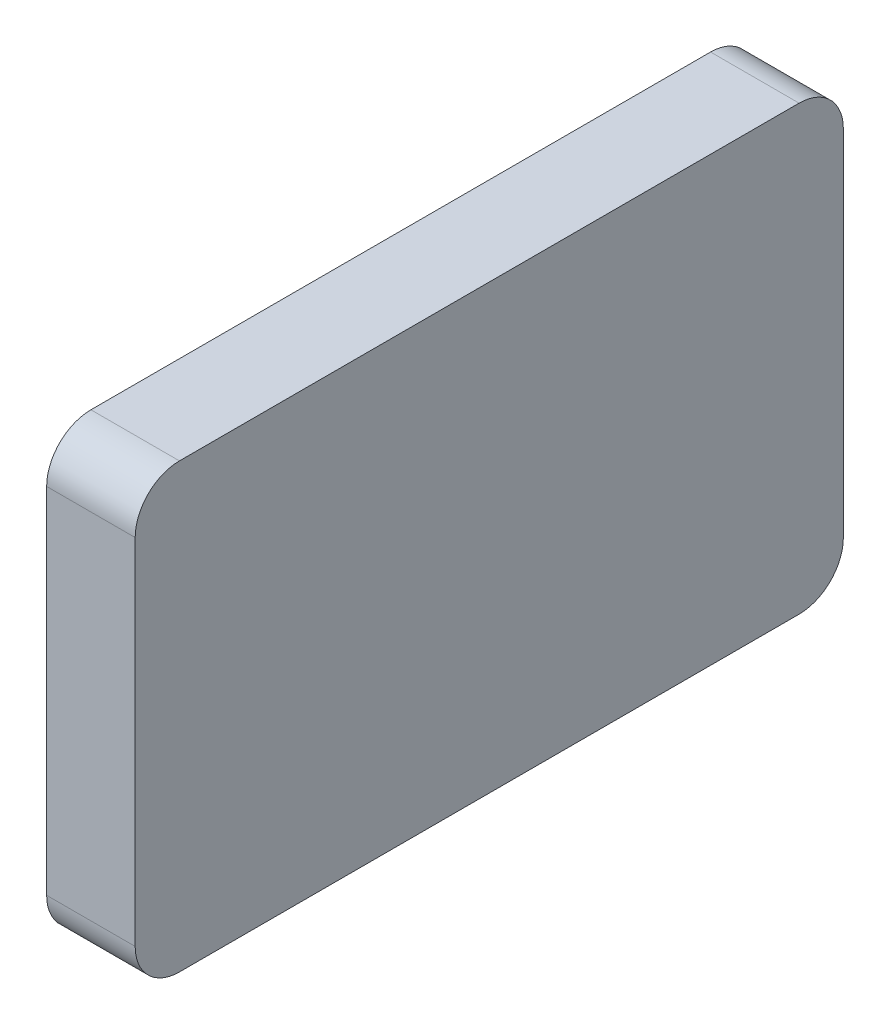
ISO-10303-21;
HEADER;
FILE_DESCRIPTION(('STEP AP214'),'2;1');
FILE_NAME('part.step','',(''),(''),'','','');
FILE_SCHEMA(('AUTOMOTIVE_DESIGN { 1 0 10303 214 1 1 1 1 }'));
ENDSEC;
DATA;
#1=APPLICATION_CONTEXT('core data for automotive mechanical design processes');
#2=APPLICATION_PROTOCOL_DEFINITION('international standard','automotive_design',2000,#1);
#3=PRODUCT_CONTEXT('',#1,'mechanical');
#4=PRODUCT('Part','Part','',(#3));
#5=PRODUCT_RELATED_PRODUCT_CATEGORY('part','',(#4));
#6=PRODUCT_DEFINITION_FORMATION('','',#4);
#7=PRODUCT_DEFINITION_CONTEXT('part definition',#1,'design');
#8=PRODUCT_DEFINITION('design','',#6,#7);
#9=PRODUCT_DEFINITION_SHAPE('','',#8);
#10=(LENGTH_UNIT() NAMED_UNIT(*) SI_UNIT(.MILLI.,.METRE.));
#11=(NAMED_UNIT(*) PLANE_ANGLE_UNIT() SI_UNIT($,.RADIAN.));
#12=(NAMED_UNIT(*) SI_UNIT($,.STERADIAN.) SOLID_ANGLE_UNIT());
#13=UNCERTAINTY_MEASURE_WITH_UNIT(LENGTH_MEASURE(1.E-05),#10,'distance_accuracy_value','');
#14=(GEOMETRIC_REPRESENTATION_CONTEXT(3) GLOBAL_UNCERTAINTY_ASSIGNED_CONTEXT((#13)) GLOBAL_UNIT_ASSIGNED_CONTEXT((#10,
#11,#12)) REPRESENTATION_CONTEXT('',''));
#15=CARTESIAN_POINT('',(0.,0.,0.));
#16=DIRECTION('',(0.,0.,1.));
#17=DIRECTION('',(1.,0.,0.));
#18=AXIS2_PLACEMENT_3D('',#15,#16,#17);
#19=CARTESIAN_POINT('',(0.5,2.5,-4.));
#20=DIRECTION('',(0.,0.,1.));
#21=DIRECTION('',(0.,-1.,0.));
#22=AXIS2_PLACEMENT_3D('',#19,#20,#21);
#23=PLANE('',#22);
#24=DIRECTION('',(0.,1.,0.));
#25=VECTOR('',#24,1.);
#26=CARTESIAN_POINT('',(0.5,2.5,-4.));
#27=LINE('',#26,#25);
#28=CARTESIAN_POINT('',(0.5,-2.,-4.));
#29=VERTEX_POINT('',#28);
#30=CARTESIAN_POINT('',(0.5,2.,-4.));
#31=VERTEX_POINT('',#30);
#32=EDGE_CURVE('E102',#29,#31,#27,.T.);
#33=ORIENTED_EDGE('',*,*,#32,.F.);
#34=DIRECTION('',(-1.,0.,0.));
#35=VECTOR('',#34,1.);
#36=CARTESIAN_POINT('',(0.5,-2.,-4.));
#37=LINE('',#36,#35);
#38=CARTESIAN_POINT('',(-0.5,-2.,-4.));
#39=VERTEX_POINT('',#38);
#40=EDGE_CURVE('E87',#29,#39,#37,.T.);
#41=ORIENTED_EDGE('',*,*,#40,.T.);
#42=DIRECTION('',(0.,1.,0.));
#43=VECTOR('',#42,1.);
#44=CARTESIAN_POINT('',(-0.5,2.5,-4.));
#45=LINE('',#44,#43);
#46=CARTESIAN_POINT('',(-0.5,2.,-4.));
#47=VERTEX_POINT('',#46);
#48=EDGE_CURVE('E99',#39,#47,#45,.T.);
#49=ORIENTED_EDGE('',*,*,#48,.T.);
#50=DIRECTION('',(-1.,0.,0.));
#51=VECTOR('',#50,1.);
#52=CARTESIAN_POINT('',(0.5,2.,-4.));
#53=LINE('',#52,#51);
#54=EDGE_CURVE('E104',#47,#31,#53,.F.);
#55=ORIENTED_EDGE('',*,*,#54,.T.);
#56=EDGE_LOOP('',(#33,#41,#49,#55));
#57=FACE_BOUND('',#56,.T.);
#58=ADVANCED_FACE('F17',(#57),#23,.F.);
#59=CARTESIAN_POINT('',(0.5,2.5,4.));
#60=DIRECTION('',(0.,-1.,0.));
#61=DIRECTION('',(0.,0.,-1.));
#62=AXIS2_PLACEMENT_3D('',#59,#60,#61);
#63=PLANE('',#62);
#64=DIRECTION('',(0.,0.,1.));
#65=VECTOR('',#64,1.);
#66=CARTESIAN_POINT('',(-0.5,2.5,4.));
#67=LINE('',#66,#65);
#68=CARTESIAN_POINT('',(-0.5,2.5,-3.5));
#69=VERTEX_POINT('',#68);
#70=CARTESIAN_POINT('',(-0.5,2.5,3.5));
#71=VERTEX_POINT('',#70);
#72=EDGE_CURVE('E108',#69,#71,#67,.T.);
#73=ORIENTED_EDGE('',*,*,#72,.T.);
#74=DIRECTION('',(-1.,0.,0.));
#75=VECTOR('',#74,1.);
#76=CARTESIAN_POINT('',(0.5,2.5,3.5));
#77=LINE('',#76,#75);
#78=CARTESIAN_POINT('',(0.5,2.5,3.5));
#79=VERTEX_POINT('',#78);
#80=EDGE_CURVE('E11',#71,#79,#77,.F.);
#81=ORIENTED_EDGE('',*,*,#80,.T.);
#82=DIRECTION('',(0.,0.,1.));
#83=VECTOR('',#82,1.);
#84=CARTESIAN_POINT('',(0.5,2.5,4.));
#85=LINE('',#84,#83);
#86=CARTESIAN_POINT('',(0.5,2.5,-3.5));
#87=VERTEX_POINT('',#86);
#88=EDGE_CURVE('E144',#87,#79,#85,.T.);
#89=ORIENTED_EDGE('',*,*,#88,.F.);
#90=DIRECTION('',(-1.,0.,0.));
#91=VECTOR('',#90,1.);
#92=CARTESIAN_POINT('',(0.5,2.5,-3.5));
#93=LINE('',#92,#91);
#94=EDGE_CURVE('E25',#87,#69,#93,.T.);
#95=ORIENTED_EDGE('',*,*,#94,.T.);
#96=EDGE_LOOP('',(#73,#81,#89,#95));
#97=FACE_BOUND('',#96,.T.);
#98=ADVANCED_FACE('F142',(#97),#63,.F.);
#99=CARTESIAN_POINT('',(0.5,2.5,4.));
#100=DIRECTION('',(0.,0.,-1.));
#101=DIRECTION('',(0.,1.,0.));
#102=AXIS2_PLACEMENT_3D('',#99,#100,#101);
#103=PLANE('',#102);
#104=DIRECTION('',(0.,-1.,0.));
#105=VECTOR('',#104,1.);
#106=CARTESIAN_POINT('',(-0.5,2.5,4.));
#107=LINE('',#106,#105);
#108=CARTESIAN_POINT('',(-0.5,2.,4.));
#109=VERTEX_POINT('',#108);
#110=CARTESIAN_POINT('',(-0.5,-2.,4.));
#111=VERTEX_POINT('',#110);
#112=EDGE_CURVE('E111',#109,#111,#107,.T.);
#113=ORIENTED_EDGE('',*,*,#112,.T.);
#114=DIRECTION('',(-1.,0.,0.));
#115=VECTOR('',#114,1.);
#116=CARTESIAN_POINT('',(0.5,-2.,4.));
#117=LINE('',#116,#115);
#118=CARTESIAN_POINT('',(0.5,-2.,4.));
#119=VERTEX_POINT('',#118);
#120=EDGE_CURVE('E32',#111,#119,#117,.F.);
#121=ORIENTED_EDGE('',*,*,#120,.T.);
#122=DIRECTION('',(0.,-1.,0.));
#123=VECTOR('',#122,1.);
#124=CARTESIAN_POINT('',(0.5,2.5,4.));
#125=LINE('',#124,#123);
#126=CARTESIAN_POINT('',(0.5,2.,4.));
#127=VERTEX_POINT('',#126);
#128=EDGE_CURVE('E152',#127,#119,#125,.T.);
#129=ORIENTED_EDGE('',*,*,#128,.F.);
#130=DIRECTION('',(-1.,0.,0.));
#131=VECTOR('',#130,1.);
#132=CARTESIAN_POINT('',(0.5,2.,4.));
#133=LINE('',#132,#131);
#134=EDGE_CURVE('E135',#127,#109,#133,.T.);
#135=ORIENTED_EDGE('',*,*,#134,.T.);
#136=EDGE_LOOP('',(#113,#121,#129,#135));
#137=FACE_BOUND('',#136,.T.);
#138=ADVANCED_FACE('F151',(#137),#103,.F.);
#139=CARTESIAN_POINT('',(0.5,-2.5,4.));
#140=DIRECTION('',(0.,1.,0.));
#141=DIRECTION('',(0.,0.,1.));
#142=AXIS2_PLACEMENT_3D('',#139,#140,#141);
#143=PLANE('',#142);
#144=DIRECTION('',(0.,0.,-1.));
#145=VECTOR('',#144,1.);
#146=CARTESIAN_POINT('',(-0.5,-2.5,4.));
#147=LINE('',#146,#145);
#148=CARTESIAN_POINT('',(-0.5,-2.5,3.5));
#149=VERTEX_POINT('',#148);
#150=CARTESIAN_POINT('',(-0.5,-2.5,-3.5));
#151=VERTEX_POINT('',#150);
#152=EDGE_CURVE('E118',#149,#151,#147,.T.);
#153=ORIENTED_EDGE('',*,*,#152,.T.);
#154=DIRECTION('',(-1.,0.,0.));
#155=VECTOR('',#154,1.);
#156=CARTESIAN_POINT('',(0.5,-2.5,-3.5));
#157=LINE('',#156,#155);
#158=CARTESIAN_POINT('',(0.5,-2.5,-3.5));
#159=VERTEX_POINT('',#158);
#160=EDGE_CURVE('E88',#151,#159,#157,.F.);
#161=ORIENTED_EDGE('',*,*,#160,.T.);
#162=DIRECTION('',(0.,0.,-1.));
#163=VECTOR('',#162,1.);
#164=CARTESIAN_POINT('',(0.5,-2.5,4.));
#165=LINE('',#164,#163);
#166=CARTESIAN_POINT('',(0.5,-2.5,3.5));
#167=VERTEX_POINT('',#166);
#168=EDGE_CURVE('E114',#167,#159,#165,.T.);
#169=ORIENTED_EDGE('',*,*,#168,.F.);
#170=DIRECTION('',(-1.,0.,0.));
#171=VECTOR('',#170,1.);
#172=CARTESIAN_POINT('',(0.5,-2.5,3.5));
#173=LINE('',#172,#171);
#174=EDGE_CURVE('E93',#167,#149,#173,.T.);
#175=ORIENTED_EDGE('',*,*,#174,.T.);
#176=EDGE_LOOP('',(#153,#161,#169,#175));
#177=FACE_BOUND('',#176,.T.);
#178=ADVANCED_FACE('F184',(#177),#143,.F.);
#179=CARTESIAN_POINT('',(0.5,0.,0.));
#180=DIRECTION('',(1.,0.,0.));
#181=DIRECTION('',(0.,0.,-1.));
#182=AXIS2_PLACEMENT_3D('',#179,#180,#181);
#183=PLANE('',#182);
#184=ORIENTED_EDGE('',*,*,#168,.T.);
#185=CARTESIAN_POINT('',(0.5,-2.,-3.5));
#186=DIRECTION('',(1.,0.,0.));
#187=DIRECTION('',(0.,0.,-1.));
#188=AXIS2_PLACEMENT_3D('',#185,#186,#187);
#189=CIRCLE('',#188,0.5);
#190=EDGE_CURVE('E133',#159,#29,#189,.T.);
#191=ORIENTED_EDGE('',*,*,#190,.T.);
#192=ORIENTED_EDGE('',*,*,#32,.T.);
#193=CARTESIAN_POINT('',(0.5,2.,-3.5));
#194=DIRECTION('',(1.,0.,0.));
#195=DIRECTION('',(0.,0.,-1.));
#196=AXIS2_PLACEMENT_3D('',#193,#194,#195);
#197=CIRCLE('',#196,0.5);
#198=EDGE_CURVE('E128',#31,#87,#197,.T.);
#199=ORIENTED_EDGE('',*,*,#198,.T.);
#200=ORIENTED_EDGE('',*,*,#88,.T.);
#201=CARTESIAN_POINT('',(0.5,2.,3.5));
#202=DIRECTION('',(1.,0.,0.));
#203=DIRECTION('',(0.,0.,-1.));
#204=AXIS2_PLACEMENT_3D('',#201,#202,#203);
#205=CIRCLE('',#204,0.5);
#206=EDGE_CURVE('E39',#79,#127,#205,.T.);
#207=ORIENTED_EDGE('',*,*,#206,.T.);
#208=ORIENTED_EDGE('',*,*,#128,.T.);
#209=CARTESIAN_POINT('',(0.5,-2.,3.5));
#210=DIRECTION('',(1.,0.,0.));
#211=DIRECTION('',(0.,0.,-1.));
#212=AXIS2_PLACEMENT_3D('',#209,#210,#211);
#213=CIRCLE('',#212,0.5);
#214=EDGE_CURVE('E131',#119,#167,#213,.T.);
#215=ORIENTED_EDGE('',*,*,#214,.T.);
#216=EDGE_LOOP('',(#184,#191,#192,#199,#200,#207,#208,#215));
#217=FACE_BOUND('',#216,.T.);
#218=ADVANCED_FACE('F157',(#217),#183,.T.);
#219=CARTESIAN_POINT('',(-0.5,0.,0.));
#220=DIRECTION('',(1.,0.,0.));
#221=DIRECTION('',(0.,0.,-1.));
#222=AXIS2_PLACEMENT_3D('',#219,#220,#221);
#223=PLANE('',#222);
#224=ORIENTED_EDGE('',*,*,#48,.F.);
#225=CARTESIAN_POINT('',(-0.5,-2.,-3.5));
#226=DIRECTION('',(1.,0.,0.));
#227=DIRECTION('',(0.,0.,-1.));
#228=AXIS2_PLACEMENT_3D('',#225,#226,#227);
#229=CIRCLE('',#228,0.5);
#230=EDGE_CURVE('E83',#39,#151,#229,.F.);
#231=ORIENTED_EDGE('',*,*,#230,.T.);
#232=ORIENTED_EDGE('',*,*,#152,.F.);
#233=CARTESIAN_POINT('',(-0.5,-2.,3.5));
#234=DIRECTION('',(1.,0.,0.));
#235=DIRECTION('',(0.,0.,-1.));
#236=AXIS2_PLACEMENT_3D('',#233,#234,#235);
#237=CIRCLE('',#236,0.5);
#238=EDGE_CURVE('E94',#149,#111,#237,.F.);
#239=ORIENTED_EDGE('',*,*,#238,.T.);
#240=ORIENTED_EDGE('',*,*,#112,.F.);
#241=CARTESIAN_POINT('',(-0.5,2.,3.5));
#242=DIRECTION('',(1.,0.,0.));
#243=DIRECTION('',(0.,0.,-1.));
#244=AXIS2_PLACEMENT_3D('',#241,#242,#243);
#245=CIRCLE('',#244,0.5);
#246=EDGE_CURVE('E122',#109,#71,#245,.F.);
#247=ORIENTED_EDGE('',*,*,#246,.T.);
#248=ORIENTED_EDGE('',*,*,#72,.F.);
#249=CARTESIAN_POINT('',(-0.5,2.,-3.5));
#250=DIRECTION('',(1.,0.,0.));
#251=DIRECTION('',(0.,0.,-1.));
#252=AXIS2_PLACEMENT_3D('',#249,#250,#251);
#253=CIRCLE('',#252,0.5);
#254=EDGE_CURVE('E103',#69,#47,#253,.F.);
#255=ORIENTED_EDGE('',*,*,#254,.T.);
#256=EDGE_LOOP('',(#224,#231,#232,#239,#240,#247,#248,#255));
#257=FACE_BOUND('',#256,.T.);
#258=ADVANCED_FACE('F106',(#257),#223,.F.);
#259=CARTESIAN_POINT('',(0.5,-2.,-3.5));
#260=DIRECTION('',(-1.,0.,0.));
#261=DIRECTION('',(0.,0.,1.));
#262=AXIS2_PLACEMENT_3D('',#259,#260,#261);
#263=CYLINDRICAL_SURFACE('',#262,0.5);
#264=ORIENTED_EDGE('',*,*,#190,.F.);
#265=ORIENTED_EDGE('',*,*,#160,.F.);
#266=ORIENTED_EDGE('',*,*,#230,.F.);
#267=ORIENTED_EDGE('',*,*,#40,.F.);
#268=EDGE_LOOP('',(#264,#265,#266,#267));
#269=FACE_BOUND('',#268,.T.);
#270=ADVANCED_FACE('F86',(#269),#263,.T.);
#271=CARTESIAN_POINT('',(0.5,-2.,3.5));
#272=DIRECTION('',(-1.,0.,0.));
#273=DIRECTION('',(0.,0.,1.));
#274=AXIS2_PLACEMENT_3D('',#271,#272,#273);
#275=CYLINDRICAL_SURFACE('',#274,0.5);
#276=ORIENTED_EDGE('',*,*,#214,.F.);
#277=ORIENTED_EDGE('',*,*,#120,.F.);
#278=ORIENTED_EDGE('',*,*,#238,.F.);
#279=ORIENTED_EDGE('',*,*,#174,.F.);
#280=EDGE_LOOP('',(#276,#277,#278,#279));
#281=FACE_BOUND('',#280,.T.);
#282=ADVANCED_FACE('F164',(#281),#275,.T.);
#283=CARTESIAN_POINT('',(0.5,2.,3.5));
#284=DIRECTION('',(-1.,0.,0.));
#285=DIRECTION('',(0.,0.,1.));
#286=AXIS2_PLACEMENT_3D('',#283,#284,#285);
#287=CYLINDRICAL_SURFACE('',#286,0.5);
#288=ORIENTED_EDGE('',*,*,#206,.F.);
#289=ORIENTED_EDGE('',*,*,#80,.F.);
#290=ORIENTED_EDGE('',*,*,#246,.F.);
#291=ORIENTED_EDGE('',*,*,#134,.F.);
#292=EDGE_LOOP('',(#288,#289,#290,#291));
#293=FACE_BOUND('',#292,.T.);
#294=ADVANCED_FACE('F150',(#293),#287,.T.);
#295=CARTESIAN_POINT('',(0.5,2.,-3.5));
#296=DIRECTION('',(-1.,0.,0.));
#297=DIRECTION('',(0.,0.,1.));
#298=AXIS2_PLACEMENT_3D('',#295,#296,#297);
#299=CYLINDRICAL_SURFACE('',#298,0.5);
#300=ORIENTED_EDGE('',*,*,#198,.F.);
#301=ORIENTED_EDGE('',*,*,#54,.F.);
#302=ORIENTED_EDGE('',*,*,#254,.F.);
#303=ORIENTED_EDGE('',*,*,#94,.F.);
#304=EDGE_LOOP('',(#300,#301,#302,#303));
#305=FACE_BOUND('',#304,.T.);
#306=ADVANCED_FACE('F19',(#305),#299,.T.);
#307=CLOSED_SHELL('',(#58,#98,#138,#178,#218,#258,#270,#282,#294,#306));
#308=MANIFOLD_SOLID_BREP('B1',#307);
#309=ADVANCED_BREP_SHAPE_REPRESENTATION('',(#18,#308),#14);
#310=SHAPE_DEFINITION_REPRESENTATION(#9,#309);
ENDSEC;
END-ISO-10303-21;
